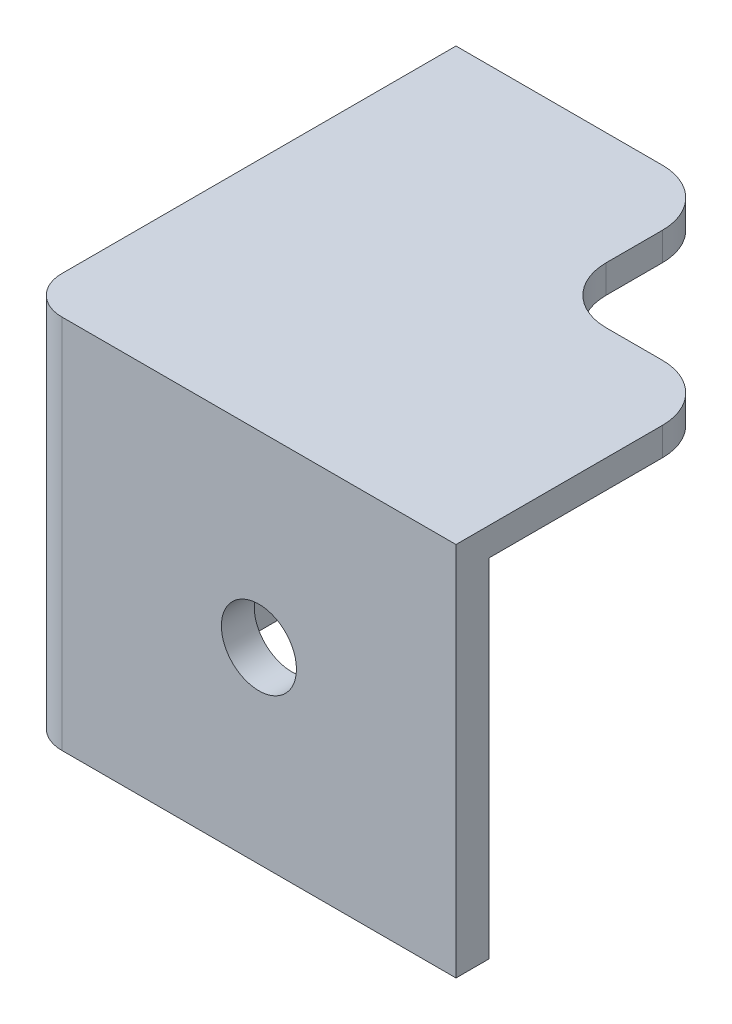
ISO-10303-21;
HEADER;
FILE_DESCRIPTION(('STEP AP214'),'2;1');
FILE_NAME('part.step','',(''),(''),'','','');
FILE_SCHEMA(('AUTOMOTIVE_DESIGN { 1 0 10303 214 1 1 1 1 }'));
ENDSEC;
DATA;
#1=APPLICATION_CONTEXT('core data for automotive mechanical design processes');
#2=APPLICATION_PROTOCOL_DEFINITION('international standard','automotive_design',2000,#1);
#3=PRODUCT_CONTEXT('',#1,'mechanical');
#4=PRODUCT('Part','Part','',(#3));
#5=PRODUCT_RELATED_PRODUCT_CATEGORY('part','',(#4));
#6=PRODUCT_DEFINITION_FORMATION('','',#4);
#7=PRODUCT_DEFINITION_CONTEXT('part definition',#1,'design');
#8=PRODUCT_DEFINITION('design','',#6,#7);
#9=PRODUCT_DEFINITION_SHAPE('','',#8);
#10=(LENGTH_UNIT() NAMED_UNIT(*) SI_UNIT(.MILLI.,.METRE.));
#11=(NAMED_UNIT(*) PLANE_ANGLE_UNIT() SI_UNIT($,.RADIAN.));
#12=(NAMED_UNIT(*) SI_UNIT($,.STERADIAN.) SOLID_ANGLE_UNIT());
#13=UNCERTAINTY_MEASURE_WITH_UNIT(LENGTH_MEASURE(1.E-05),#10,'distance_accuracy_value','');
#14=(GEOMETRIC_REPRESENTATION_CONTEXT(3) GLOBAL_UNCERTAINTY_ASSIGNED_CONTEXT((#13)) GLOBAL_UNIT_ASSIGNED_CONTEXT((#10,
#11,#12)) REPRESENTATION_CONTEXT('',''));
#15=CARTESIAN_POINT('',(0.,0.,0.));
#16=DIRECTION('',(0.,0.,1.));
#17=DIRECTION('',(1.,0.,0.));
#18=AXIS2_PLACEMENT_3D('',#15,#16,#17);
#19=CARTESIAN_POINT('',(0.,20.,-23.));
#20=DIRECTION('',(1.,0.,0.));
#21=DIRECTION('',(0.,0.,-1.));
#22=AXIS2_PLACEMENT_3D('',#19,#20,#21);
#23=PLANE('',#22);
#24=CARTESIAN_POINT('',(0.,10.,-12.5));
#25=DIRECTION('',(-1.,0.,0.));
#26=DIRECTION('',(0.,0.,1.));
#27=AXIS2_PLACEMENT_3D('',#24,#25,#26);
#28=CIRCLE('',#27,2.);
#29=CARTESIAN_POINT('',(0.,10.,-10.5));
#30=VERTEX_POINT('',#29);
#31=EDGE_CURVE('E282',#30,#30,#28,.T.);
#32=ORIENTED_EDGE('',*,*,#31,.F.);
#33=EDGE_LOOP('',(#32));
#34=FACE_BOUND('',#33,.T.);
#35=DIRECTION('',(0.,0.,1.));
#36=VECTOR('',#35,1.);
#37=CARTESIAN_POINT('',(0.,0.,-23.));
#38=LINE('',#37,#36);
#39=CARTESIAN_POINT('',(0.,0.,-23.));
#40=VERTEX_POINT('',#39);
#41=CARTESIAN_POINT('',(0.,0.,-2.));
#42=VERTEX_POINT('',#41);
#43=EDGE_CURVE('E179',#40,#42,#38,.T.);
#44=ORIENTED_EDGE('',*,*,#43,.T.);
#45=DIRECTION('',(0.,-1.,0.));
#46=VECTOR('',#45,1.);
#47=CARTESIAN_POINT('',(0.,20.,-2.));
#48=LINE('',#47,#46);
#49=CARTESIAN_POINT('',(0.,20.,-2.));
#50=VERTEX_POINT('',#49);
#51=EDGE_CURVE('E229',#42,#50,#48,.F.);
#52=ORIENTED_EDGE('',*,*,#51,.T.);
#53=DIRECTION('',(0.,0.,1.));
#54=VECTOR('',#53,1.);
#55=CARTESIAN_POINT('',(0.,20.,-23.));
#56=LINE('',#55,#54);
#57=CARTESIAN_POINT('',(0.,20.,-23.));
#58=VERTEX_POINT('',#57);
#59=EDGE_CURVE('E184',#58,#50,#56,.T.);
#60=ORIENTED_EDGE('',*,*,#59,.F.);
#61=DIRECTION('',(0.,-1.,0.));
#62=VECTOR('',#61,1.);
#63=CARTESIAN_POINT('',(0.,20.,-23.));
#64=LINE('',#63,#62);
#65=EDGE_CURVE('E205',#58,#40,#64,.T.);
#66=ORIENTED_EDGE('',*,*,#65,.T.);
#67=EDGE_LOOP('',(#44,#52,#60,#66));
#68=FACE_BOUND('',#67,.T.);
#69=ADVANCED_FACE('F39',(#34,#68),#23,.F.);
#70=CARTESIAN_POINT('',(0.,20.,0.));
#71=DIRECTION('',(0.,0.,-1.));
#72=DIRECTION('',(-1.,0.,0.));
#73=AXIS2_PLACEMENT_3D('',#70,#71,#72);
#74=PLANE('',#73);
#75=CARTESIAN_POINT('',(12.5,10.,0.));
#76=DIRECTION('',(0.,0.,1.));
#77=DIRECTION('',(1.,0.,0.));
#78=AXIS2_PLACEMENT_3D('',#75,#76,#77);
#79=CIRCLE('',#78,2.);
#80=CARTESIAN_POINT('',(14.5,10.,0.));
#81=VERTEX_POINT('',#80);
#82=EDGE_CURVE('E295',#81,#81,#79,.T.);
#83=ORIENTED_EDGE('',*,*,#82,.F.);
#84=EDGE_LOOP('',(#83));
#85=FACE_BOUND('',#84,.T.);
#86=DIRECTION('',(1.,0.,0.));
#87=VECTOR('',#86,1.);
#88=CARTESIAN_POINT('',(0.,20.,0.));
#89=LINE('',#88,#87);
#90=CARTESIAN_POINT('',(2.,20.,0.));
#91=VERTEX_POINT('',#90);
#92=CARTESIAN_POINT('',(23.,20.,0.));
#93=VERTEX_POINT('',#92);
#94=EDGE_CURVE('E188',#91,#93,#89,.T.);
#95=ORIENTED_EDGE('',*,*,#94,.F.);
#96=DIRECTION('',(0.,-1.,0.));
#97=VECTOR('',#96,1.);
#98=CARTESIAN_POINT('',(2.,20.,0.));
#99=LINE('',#98,#97);
#100=CARTESIAN_POINT('',(2.,0.,0.));
#101=VERTEX_POINT('',#100);
#102=EDGE_CURVE('E222',#91,#101,#99,.T.);
#103=ORIENTED_EDGE('',*,*,#102,.T.);
#104=DIRECTION('',(1.,0.,0.));
#105=VECTOR('',#104,1.);
#106=CARTESIAN_POINT('',(0.,0.,0.));
#107=LINE('',#106,#105);
#108=CARTESIAN_POINT('',(23.,0.,0.));
#109=VERTEX_POINT('',#108);
#110=EDGE_CURVE('E209',#101,#109,#107,.T.);
#111=ORIENTED_EDGE('',*,*,#110,.T.);
#112=DIRECTION('',(0.,-1.,0.));
#113=VECTOR('',#112,1.);
#114=CARTESIAN_POINT('',(23.,20.,0.));
#115=LINE('',#114,#113);
#116=EDGE_CURVE('E219',#93,#109,#115,.T.);
#117=ORIENTED_EDGE('',*,*,#116,.F.);
#118=EDGE_LOOP('',(#95,#103,#111,#117));
#119=FACE_BOUND('',#118,.T.);
#120=ADVANCED_FACE('F334',(#85,#119),#74,.F.);
#121=CARTESIAN_POINT('',(23.,20.,0.));
#122=DIRECTION('',(-1.,0.,0.));
#123=DIRECTION('',(0.,0.,1.));
#124=AXIS2_PLACEMENT_3D('',#121,#122,#123);
#125=PLANE('',#124);
#126=DIRECTION('',(0.,0.,1.));
#127=VECTOR('',#126,1.);
#128=CARTESIAN_POINT('',(23.,18.5,-1.75));
#129=LINE('',#128,#127);
#130=CARTESIAN_POINT('',(23.,18.5,-11.));
#131=VERTEX_POINT('',#130);
#132=CARTESIAN_POINT('',(23.,18.5,-1.75));
#133=VERTEX_POINT('',#132);
#134=EDGE_CURVE('E144',#131,#133,#129,.T.);
#135=ORIENTED_EDGE('',*,*,#134,.F.);
#136=DIRECTION('',(0.,-1.,0.));
#137=VECTOR('',#136,1.);
#138=CARTESIAN_POINT('',(23.,20.,-11.));
#139=LINE('',#138,#137);
#140=CARTESIAN_POINT('',(23.,20.,-11.));
#141=VERTEX_POINT('',#140);
#142=EDGE_CURVE('E274',#131,#141,#139,.F.);
#143=ORIENTED_EDGE('',*,*,#142,.T.);
#144=DIRECTION('',(0.,0.,-1.));
#145=VECTOR('',#144,1.);
#146=CARTESIAN_POINT('',(23.,20.,0.));
#147=LINE('',#146,#145);
#148=EDGE_CURVE('E192',#93,#141,#147,.T.);
#149=ORIENTED_EDGE('',*,*,#148,.F.);
#150=ORIENTED_EDGE('',*,*,#116,.T.);
#151=DIRECTION('',(0.,0.,-1.));
#152=VECTOR('',#151,1.);
#153=CARTESIAN_POINT('',(23.,0.,0.));
#154=LINE('',#153,#152);
#155=CARTESIAN_POINT('',(23.,0.,-1.75));
#156=VERTEX_POINT('',#155);
#157=EDGE_CURVE('E172',#109,#156,#154,.T.);
#158=ORIENTED_EDGE('',*,*,#157,.T.);
#159=DIRECTION('',(0.,-1.,0.));
#160=VECTOR('',#159,1.);
#161=CARTESIAN_POINT('',(23.,18.5,-1.75));
#162=LINE('',#161,#160);
#163=EDGE_CURVE('E161',#133,#156,#162,.T.);
#164=ORIENTED_EDGE('',*,*,#163,.F.);
#165=EDGE_LOOP('',(#135,#143,#149,#150,#158,#164));
#166=FACE_BOUND('',#165,.T.);
#167=ADVANCED_FACE('F169',(#166),#125,.F.);
#168=CARTESIAN_POINT('',(23.,20.,-14.));
#169=DIRECTION('',(0.,0.,1.));
#170=DIRECTION('',(1.,0.,0.));
#171=AXIS2_PLACEMENT_3D('',#168,#169,#170);
#172=PLANE('',#171);
#173=DIRECTION('',(-1.,0.,0.));
#174=VECTOR('',#173,1.);
#175=CARTESIAN_POINT('',(23.,20.,-14.));
#176=LINE('',#175,#174);
#177=CARTESIAN_POINT('',(20.,20.,-14.));
#178=VERTEX_POINT('',#177);
#179=CARTESIAN_POINT('',(17.,20.,-14.));
#180=VERTEX_POINT('',#179);
#181=EDGE_CURVE('E195',#178,#180,#176,.T.);
#182=ORIENTED_EDGE('',*,*,#181,.F.);
#183=DIRECTION('',(0.,-1.,0.));
#184=VECTOR('',#183,1.);
#185=CARTESIAN_POINT('',(20.,20.,-14.));
#186=LINE('',#185,#184);
#187=CARTESIAN_POINT('',(20.,18.5,-14.));
#188=VERTEX_POINT('',#187);
#189=EDGE_CURVE('E270',#178,#188,#186,.T.);
#190=ORIENTED_EDGE('',*,*,#189,.T.);
#191=DIRECTION('',(1.,0.,0.));
#192=VECTOR('',#191,1.);
#193=CARTESIAN_POINT('',(23.,18.5,-14.));
#194=LINE('',#193,#192);
#195=CARTESIAN_POINT('',(17.,18.5,-14.));
#196=VERTEX_POINT('',#195);
#197=EDGE_CURVE('E156',#196,#188,#194,.T.);
#198=ORIENTED_EDGE('',*,*,#197,.F.);
#199=DIRECTION('',(0.,-1.,0.));
#200=VECTOR('',#199,1.);
#201=CARTESIAN_POINT('',(17.,20.,-14.));
#202=LINE('',#201,#200);
#203=EDGE_CURVE('E57',#196,#180,#202,.F.);
#204=ORIENTED_EDGE('',*,*,#203,.T.);
#205=EDGE_LOOP('',(#182,#190,#198,#204));
#206=FACE_BOUND('',#205,.T.);
#207=ADVANCED_FACE('F339',(#206),#172,.F.);
#208=CARTESIAN_POINT('',(14.,20.,-14.));
#209=DIRECTION('',(-1.,0.,0.));
#210=DIRECTION('',(0.,0.,1.));
#211=AXIS2_PLACEMENT_3D('',#208,#209,#210);
#212=PLANE('',#211);
#213=DIRECTION('',(0.,0.,1.));
#214=VECTOR('',#213,1.);
#215=CARTESIAN_POINT('',(14.,18.5,-14.));
#216=LINE('',#215,#214);
#217=CARTESIAN_POINT('',(14.,18.5,-20.));
#218=VERTEX_POINT('',#217);
#219=CARTESIAN_POINT('',(14.,18.5,-17.));
#220=VERTEX_POINT('',#219);
#221=EDGE_CURVE('E301',#218,#220,#216,.T.);
#222=ORIENTED_EDGE('',*,*,#221,.F.);
#223=DIRECTION('',(0.,-1.,0.));
#224=VECTOR('',#223,1.);
#225=CARTESIAN_POINT('',(14.,20.,-20.));
#226=LINE('',#225,#224);
#227=CARTESIAN_POINT('',(14.,20.,-20.));
#228=VERTEX_POINT('',#227);
#229=EDGE_CURVE('E260',#218,#228,#226,.F.);
#230=ORIENTED_EDGE('',*,*,#229,.T.);
#231=DIRECTION('',(0.,0.,-1.));
#232=VECTOR('',#231,1.);
#233=CARTESIAN_POINT('',(14.,20.,-14.));
#234=LINE('',#233,#232);
#235=CARTESIAN_POINT('',(14.,20.,-17.));
#236=VERTEX_POINT('',#235);
#237=EDGE_CURVE('E198',#236,#228,#234,.T.);
#238=ORIENTED_EDGE('',*,*,#237,.F.);
#239=DIRECTION('',(0.,-1.,0.));
#240=VECTOR('',#239,1.);
#241=CARTESIAN_POINT('',(14.,18.5,-17.));
#242=LINE('',#241,#240);
#243=EDGE_CURVE('E256',#236,#220,#242,.T.);
#244=ORIENTED_EDGE('',*,*,#243,.T.);
#245=EDGE_LOOP('',(#222,#230,#238,#244));
#246=FACE_BOUND('',#245,.T.);
#247=ADVANCED_FACE('F346',(#246),#212,.F.);
#248=CARTESIAN_POINT('',(14.,20.,-23.));
#249=DIRECTION('',(0.,0.,1.));
#250=DIRECTION('',(1.,0.,0.));
#251=AXIS2_PLACEMENT_3D('',#248,#249,#250);
#252=PLANE('',#251);
#253=DIRECTION('',(-1.,0.,0.));
#254=VECTOR('',#253,1.);
#255=CARTESIAN_POINT('',(14.,20.,-23.));
#256=LINE('',#255,#254);
#257=CARTESIAN_POINT('',(11.,20.,-23.));
#258=VERTEX_POINT('',#257);
#259=EDGE_CURVE('E202',#258,#58,#256,.T.);
#260=ORIENTED_EDGE('',*,*,#259,.F.);
#261=DIRECTION('',(0.,-1.,0.));
#262=VECTOR('',#261,1.);
#263=CARTESIAN_POINT('',(11.,20.,-23.));
#264=LINE('',#263,#262);
#265=CARTESIAN_POINT('',(11.,18.5,-23.));
#266=VERTEX_POINT('',#265);
#267=EDGE_CURVE('E247',#258,#266,#264,.T.);
#268=ORIENTED_EDGE('',*,*,#267,.T.);
#269=DIRECTION('',(1.,0.,0.));
#270=VECTOR('',#269,1.);
#271=CARTESIAN_POINT('',(14.,18.5,-23.));
#272=LINE('',#271,#270);
#273=CARTESIAN_POINT('',(1.75,18.5,-23.));
#274=VERTEX_POINT('',#273);
#275=EDGE_CURVE('E298',#274,#266,#272,.T.);
#276=ORIENTED_EDGE('',*,*,#275,.F.);
#277=DIRECTION('',(0.,-1.,0.));
#278=VECTOR('',#277,1.);
#279=CARTESIAN_POINT('',(1.75,18.5,-23.));
#280=LINE('',#279,#278);
#281=CARTESIAN_POINT('',(1.75,0.,-23.));
#282=VERTEX_POINT('',#281);
#283=EDGE_CURVE('E174',#274,#282,#280,.T.);
#284=ORIENTED_EDGE('',*,*,#283,.T.);
#285=DIRECTION('',(-1.,0.,0.));
#286=VECTOR('',#285,1.);
#287=CARTESIAN_POINT('',(14.,0.,-23.));
#288=LINE('',#287,#286);
#289=EDGE_CURVE('E189',#282,#40,#288,.T.);
#290=ORIENTED_EDGE('',*,*,#289,.T.);
#291=ORIENTED_EDGE('',*,*,#65,.F.);
#292=EDGE_LOOP('',(#260,#268,#276,#284,#290,#291));
#293=FACE_BOUND('',#292,.T.);
#294=ADVANCED_FACE('F318',(#293),#252,.F.);
#295=CARTESIAN_POINT('',(0.,20.,0.));
#296=DIRECTION('',(0.,1.,0.));
#297=DIRECTION('',(0.,0.,1.));
#298=AXIS2_PLACEMENT_3D('',#295,#296,#297);
#299=PLANE('',#298);
#300=ORIENTED_EDGE('',*,*,#237,.T.);
#301=CARTESIAN_POINT('',(11.,20.,-20.));
#302=DIRECTION('',(0.,1.,0.));
#303=DIRECTION('',(0.,0.,1.));
#304=AXIS2_PLACEMENT_3D('',#301,#302,#303);
#305=CIRCLE('',#304,3.);
#306=EDGE_CURVE('E265',#228,#258,#305,.T.);
#307=ORIENTED_EDGE('',*,*,#306,.T.);
#308=ORIENTED_EDGE('',*,*,#259,.T.);
#309=ORIENTED_EDGE('',*,*,#59,.T.);
#310=CARTESIAN_POINT('',(2.,20.,-2.));
#311=DIRECTION('',(0.,1.,0.));
#312=DIRECTION('',(0.,0.,1.));
#313=AXIS2_PLACEMENT_3D('',#310,#311,#312);
#314=CIRCLE('',#313,2.);
#315=EDGE_CURVE('E232',#50,#91,#314,.T.);
#316=ORIENTED_EDGE('',*,*,#315,.T.);
#317=ORIENTED_EDGE('',*,*,#94,.T.);
#318=ORIENTED_EDGE('',*,*,#148,.T.);
#319=CARTESIAN_POINT('',(20.,20.,-11.));
#320=DIRECTION('',(0.,1.,0.));
#321=DIRECTION('',(0.,0.,1.));
#322=AXIS2_PLACEMENT_3D('',#319,#320,#321);
#323=CIRCLE('',#322,3.);
#324=EDGE_CURVE('E64',#141,#178,#323,.T.);
#325=ORIENTED_EDGE('',*,*,#324,.T.);
#326=ORIENTED_EDGE('',*,*,#181,.T.);
#327=CARTESIAN_POINT('',(17.,20.,-17.));
#328=DIRECTION('',(0.,1.,0.));
#329=DIRECTION('',(0.,0.,1.));
#330=AXIS2_PLACEMENT_3D('',#327,#328,#329);
#331=CIRCLE('',#330,3.);
#332=EDGE_CURVE('E11',#180,#236,#331,.F.);
#333=ORIENTED_EDGE('',*,*,#332,.T.);
#334=EDGE_LOOP('',(#300,#307,#308,#309,#316,#317,#318,#325,#326,#333));
#335=FACE_BOUND('',#334,.T.);
#336=ADVANCED_FACE('F331',(#335),#299,.T.);
#337=CARTESIAN_POINT('',(0.,0.,0.));
#338=DIRECTION('',(0.,1.,0.));
#339=DIRECTION('',(0.,0.,1.));
#340=AXIS2_PLACEMENT_3D('',#337,#338,#339);
#341=PLANE('',#340);
#342=ORIENTED_EDGE('',*,*,#110,.F.);
#343=CARTESIAN_POINT('',(2.,0.,-2.));
#344=DIRECTION('',(0.,1.,0.));
#345=DIRECTION('',(0.,0.,1.));
#346=AXIS2_PLACEMENT_3D('',#343,#344,#345);
#347=CIRCLE('',#346,2.);
#348=EDGE_CURVE('E226',#101,#42,#347,.F.);
#349=ORIENTED_EDGE('',*,*,#348,.T.);
#350=ORIENTED_EDGE('',*,*,#43,.F.);
#351=ORIENTED_EDGE('',*,*,#289,.F.);
#352=DIRECTION('',(0.,0.,-1.));
#353=VECTOR('',#352,1.);
#354=CARTESIAN_POINT('',(1.75,0.,-23.));
#355=LINE('',#354,#353);
#356=CARTESIAN_POINT('',(1.75,0.,-3.75));
#357=VERTEX_POINT('',#356);
#358=EDGE_CURVE('E287',#357,#282,#355,.T.);
#359=ORIENTED_EDGE('',*,*,#358,.F.);
#360=CARTESIAN_POINT('',(3.75,0.,-3.75));
#361=DIRECTION('',(0.,1.,0.));
#362=DIRECTION('',(0.,0.,1.));
#363=AXIS2_PLACEMENT_3D('',#360,#361,#362);
#364=CIRCLE('',#363,2.);
#365=CARTESIAN_POINT('',(3.75,0.,-1.75));
#366=VERTEX_POINT('',#365);
#367=EDGE_CURVE('E244',#357,#366,#364,.T.);
#368=ORIENTED_EDGE('',*,*,#367,.T.);
#369=DIRECTION('',(-1.,0.,0.));
#370=VECTOR('',#369,1.);
#371=CARTESIAN_POINT('',(1.75,0.,-1.75));
#372=LINE('',#371,#370);
#373=EDGE_CURVE('E281',#156,#366,#372,.T.);
#374=ORIENTED_EDGE('',*,*,#373,.F.);
#375=ORIENTED_EDGE('',*,*,#157,.F.);
#376=EDGE_LOOP('',(#342,#349,#350,#351,#359,#368,#374,#375));
#377=FACE_BOUND('',#376,.T.);
#378=ADVANCED_FACE('F322',(#377),#341,.F.);
#379=CARTESIAN_POINT('',(1.75,18.5,-23.));
#380=DIRECTION('',(-1.,0.,0.));
#381=DIRECTION('',(0.,0.,1.));
#382=AXIS2_PLACEMENT_3D('',#379,#380,#381);
#383=PLANE('',#382);
#384=CARTESIAN_POINT('',(1.75,10.,-12.5));
#385=DIRECTION('',(-1.,0.,0.));
#386=DIRECTION('',(0.,0.,1.));
#387=AXIS2_PLACEMENT_3D('',#384,#385,#386);
#388=CIRCLE('',#387,2.);
#389=CARTESIAN_POINT('',(1.75,10.,-10.5));
#390=VERTEX_POINT('',#389);
#391=EDGE_CURVE('E278',#390,#390,#388,.T.);
#392=ORIENTED_EDGE('',*,*,#391,.T.);
#393=EDGE_LOOP('',(#392));
#394=FACE_BOUND('',#393,.T.);
#395=DIRECTION('',(0.,0.,-1.));
#396=VECTOR('',#395,1.);
#397=CARTESIAN_POINT('',(1.75,18.5,-23.));
#398=LINE('',#397,#396);
#399=CARTESIAN_POINT('',(1.75,18.5,-3.75));
#400=VERTEX_POINT('',#399);
#401=EDGE_CURVE('E166',#400,#274,#398,.T.);
#402=ORIENTED_EDGE('',*,*,#401,.F.);
#403=DIRECTION('',(0.,-1.,0.));
#404=VECTOR('',#403,1.);
#405=CARTESIAN_POINT('',(1.75,0.,-3.75));
#406=LINE('',#405,#404);
#407=EDGE_CURVE('E235',#400,#357,#406,.T.);
#408=ORIENTED_EDGE('',*,*,#407,.T.);
#409=ORIENTED_EDGE('',*,*,#358,.T.);
#410=ORIENTED_EDGE('',*,*,#283,.F.);
#411=EDGE_LOOP('',(#402,#408,#409,#410));
#412=FACE_BOUND('',#411,.T.);
#413=ADVANCED_FACE('F311',(#394,#412),#383,.F.);
#414=CARTESIAN_POINT('',(1.75,18.5,-1.75));
#415=DIRECTION('',(0.,0.,1.));
#416=DIRECTION('',(1.,0.,0.));
#417=AXIS2_PLACEMENT_3D('',#414,#415,#416);
#418=PLANE('',#417);
#419=CARTESIAN_POINT('',(12.5,10.,-1.75));
#420=DIRECTION('',(0.,0.,1.));
#421=DIRECTION('',(1.,0.,0.));
#422=AXIS2_PLACEMENT_3D('',#419,#420,#421);
#423=CIRCLE('',#422,2.);
#424=CARTESIAN_POINT('',(14.5,10.,-1.75));
#425=VERTEX_POINT('',#424);
#426=EDGE_CURVE('E43',#425,#425,#423,.T.);
#427=ORIENTED_EDGE('',*,*,#426,.T.);
#428=EDGE_LOOP('',(#427));
#429=FACE_BOUND('',#428,.T.);
#430=ORIENTED_EDGE('',*,*,#373,.T.);
#431=DIRECTION('',(0.,-1.,0.));
#432=VECTOR('',#431,1.);
#433=CARTESIAN_POINT('',(3.75,18.5,-1.75));
#434=LINE('',#433,#432);
#435=CARTESIAN_POINT('',(3.75,18.5,-1.75));
#436=VERTEX_POINT('',#435);
#437=EDGE_CURVE('E164',#366,#436,#434,.F.);
#438=ORIENTED_EDGE('',*,*,#437,.T.);
#439=DIRECTION('',(-1.,0.,0.));
#440=VECTOR('',#439,1.);
#441=CARTESIAN_POINT('',(1.75,18.5,-1.75));
#442=LINE('',#441,#440);
#443=EDGE_CURVE('E148',#133,#436,#442,.T.);
#444=ORIENTED_EDGE('',*,*,#443,.F.);
#445=ORIENTED_EDGE('',*,*,#163,.T.);
#446=EDGE_LOOP('',(#430,#438,#444,#445));
#447=FACE_BOUND('',#446,.T.);
#448=ADVANCED_FACE('F160',(#429,#447),#418,.F.);
#449=CARTESIAN_POINT('',(0.,18.5,0.));
#450=DIRECTION('',(0.,1.,0.));
#451=DIRECTION('',(0.,0.,1.));
#452=AXIS2_PLACEMENT_3D('',#449,#450,#451);
#453=PLANE('',#452);
#454=ORIENTED_EDGE('',*,*,#275,.T.);
#455=CARTESIAN_POINT('',(11.,18.5,-20.));
#456=DIRECTION('',(0.,1.,0.));
#457=DIRECTION('',(0.,0.,1.));
#458=AXIS2_PLACEMENT_3D('',#455,#456,#457);
#459=CIRCLE('',#458,3.);
#460=EDGE_CURVE('E253',#266,#218,#459,.F.);
#461=ORIENTED_EDGE('',*,*,#460,.T.);
#462=ORIENTED_EDGE('',*,*,#221,.T.);
#463=CARTESIAN_POINT('',(17.,18.5,-17.));
#464=DIRECTION('',(0.,1.,0.));
#465=DIRECTION('',(0.,0.,1.));
#466=AXIS2_PLACEMENT_3D('',#463,#464,#465);
#467=CIRCLE('',#466,3.);
#468=EDGE_CURVE('E49',#220,#196,#467,.T.);
#469=ORIENTED_EDGE('',*,*,#468,.T.);
#470=ORIENTED_EDGE('',*,*,#197,.T.);
#471=CARTESIAN_POINT('',(20.,18.5,-11.));
#472=DIRECTION('',(0.,1.,0.));
#473=DIRECTION('',(0.,0.,1.));
#474=AXIS2_PLACEMENT_3D('',#471,#472,#473);
#475=CIRCLE('',#474,3.);
#476=EDGE_CURVE('E151',#188,#131,#475,.F.);
#477=ORIENTED_EDGE('',*,*,#476,.T.);
#478=ORIENTED_EDGE('',*,*,#134,.T.);
#479=ORIENTED_EDGE('',*,*,#443,.T.);
#480=CARTESIAN_POINT('',(3.75,18.5,-3.75));
#481=DIRECTION('',(0.,1.,0.));
#482=DIRECTION('',(0.,0.,1.));
#483=AXIS2_PLACEMENT_3D('',#480,#481,#482);
#484=CIRCLE('',#483,2.);
#485=EDGE_CURVE('E241',#436,#400,#484,.F.);
#486=ORIENTED_EDGE('',*,*,#485,.T.);
#487=ORIENTED_EDGE('',*,*,#401,.T.);
#488=EDGE_LOOP('',(#454,#461,#462,#469,#470,#477,#478,#479,#486,#487));
#489=FACE_BOUND('',#488,.T.);
#490=ADVANCED_FACE('F147',(#489),#453,.F.);
#491=CARTESIAN_POINT('',(2.,20.,-2.));
#492=DIRECTION('',(0.,-1.,0.));
#493=DIRECTION('',(0.,0.,-1.));
#494=AXIS2_PLACEMENT_3D('',#491,#492,#493);
#495=CYLINDRICAL_SURFACE('',#494,2.);
#496=ORIENTED_EDGE('',*,*,#315,.F.);
#497=ORIENTED_EDGE('',*,*,#51,.F.);
#498=ORIENTED_EDGE('',*,*,#348,.F.);
#499=ORIENTED_EDGE('',*,*,#102,.F.);
#500=EDGE_LOOP('',(#496,#497,#498,#499));
#501=FACE_BOUND('',#500,.T.);
#502=ADVANCED_FACE('F328',(#501),#495,.T.);
#503=CARTESIAN_POINT('',(3.75,18.5,-3.75));
#504=DIRECTION('',(0.,1.,0.));
#505=DIRECTION('',(0.,0.,1.));
#506=AXIS2_PLACEMENT_3D('',#503,#504,#505);
#507=CYLINDRICAL_SURFACE('',#506,2.);
#508=ORIENTED_EDGE('',*,*,#485,.F.);
#509=ORIENTED_EDGE('',*,*,#437,.F.);
#510=ORIENTED_EDGE('',*,*,#367,.F.);
#511=ORIENTED_EDGE('',*,*,#407,.F.);
#512=EDGE_LOOP('',(#508,#509,#510,#511));
#513=FACE_BOUND('',#512,.T.);
#514=ADVANCED_FACE('F353',(#513),#507,.F.);
#515=CARTESIAN_POINT('',(11.,20.,-20.));
#516=DIRECTION('',(0.,-1.,0.));
#517=DIRECTION('',(0.,0.,-1.));
#518=AXIS2_PLACEMENT_3D('',#515,#516,#517);
#519=CYLINDRICAL_SURFACE('',#518,3.);
#520=ORIENTED_EDGE('',*,*,#306,.F.);
#521=ORIENTED_EDGE('',*,*,#229,.F.);
#522=ORIENTED_EDGE('',*,*,#460,.F.);
#523=ORIENTED_EDGE('',*,*,#267,.F.);
#524=EDGE_LOOP('',(#520,#521,#522,#523));
#525=FACE_BOUND('',#524,.T.);
#526=ADVANCED_FACE('F351',(#525),#519,.T.);
#527=CARTESIAN_POINT('',(20.,20.,-11.));
#528=DIRECTION('',(0.,-1.,0.));
#529=DIRECTION('',(0.,0.,-1.));
#530=AXIS2_PLACEMENT_3D('',#527,#528,#529);
#531=CYLINDRICAL_SURFACE('',#530,3.);
#532=ORIENTED_EDGE('',*,*,#324,.F.);
#533=ORIENTED_EDGE('',*,*,#142,.F.);
#534=ORIENTED_EDGE('',*,*,#476,.F.);
#535=ORIENTED_EDGE('',*,*,#189,.F.);
#536=EDGE_LOOP('',(#532,#533,#534,#535));
#537=FACE_BOUND('',#536,.T.);
#538=ADVANCED_FACE('F338',(#537),#531,.T.);
#539=CARTESIAN_POINT('',(17.,20.,-17.));
#540=DIRECTION('',(0.,1.,0.));
#541=DIRECTION('',(0.,0.,1.));
#542=AXIS2_PLACEMENT_3D('',#539,#540,#541);
#543=CYLINDRICAL_SURFACE('',#542,3.);
#544=ORIENTED_EDGE('',*,*,#332,.F.);
#545=ORIENTED_EDGE('',*,*,#203,.F.);
#546=ORIENTED_EDGE('',*,*,#468,.F.);
#547=ORIENTED_EDGE('',*,*,#243,.F.);
#548=EDGE_LOOP('',(#544,#545,#546,#547));
#549=FACE_BOUND('',#548,.T.);
#550=ADVANCED_FACE('F41',(#549),#543,.F.);
#551=CARTESIAN_POINT('',(18.5,10.,-12.5));
#552=DIRECTION('',(-1.,0.,0.));
#553=DIRECTION('',(0.,0.,1.));
#554=AXIS2_PLACEMENT_3D('',#551,#552,#553);
#555=CYLINDRICAL_SURFACE('',#554,2.);
#556=ORIENTED_EDGE('',*,*,#31,.T.);
#557=EDGE_LOOP('',(#556));
#558=FACE_BOUND('',#557,.T.);
#559=ORIENTED_EDGE('',*,*,#391,.F.);
#560=EDGE_LOOP('',(#559));
#561=FACE_BOUND('',#560,.T.);
#562=ADVANCED_FACE('F390',(#558,#561),#555,.F.);
#563=CARTESIAN_POINT('',(12.5,10.,-18.5));
#564=DIRECTION('',(0.,0.,1.));
#565=DIRECTION('',(1.,0.,0.));
#566=AXIS2_PLACEMENT_3D('',#563,#564,#565);
#567=CYLINDRICAL_SURFACE('',#566,2.);
#568=ORIENTED_EDGE('',*,*,#82,.T.);
#569=EDGE_LOOP('',(#568));
#570=FACE_BOUND('',#569,.T.);
#571=ORIENTED_EDGE('',*,*,#426,.F.);
#572=EDGE_LOOP('',(#571));
#573=FACE_BOUND('',#572,.T.);
#574=ADVANCED_FACE('F393',(#570,#573),#567,.F.);
#575=CLOSED_SHELL('',(#69,#120,#167,#207,#247,#294,#336,#378,#413,#448,#490,#502,#514,#526,#538,
#550,#562,#574));
#576=MANIFOLD_SOLID_BREP('B2',#575);
#577=ADVANCED_BREP_SHAPE_REPRESENTATION('',(#18,#576),#14);
#578=SHAPE_DEFINITION_REPRESENTATION(#9,#577);
ENDSEC;
END-ISO-10303-21;
